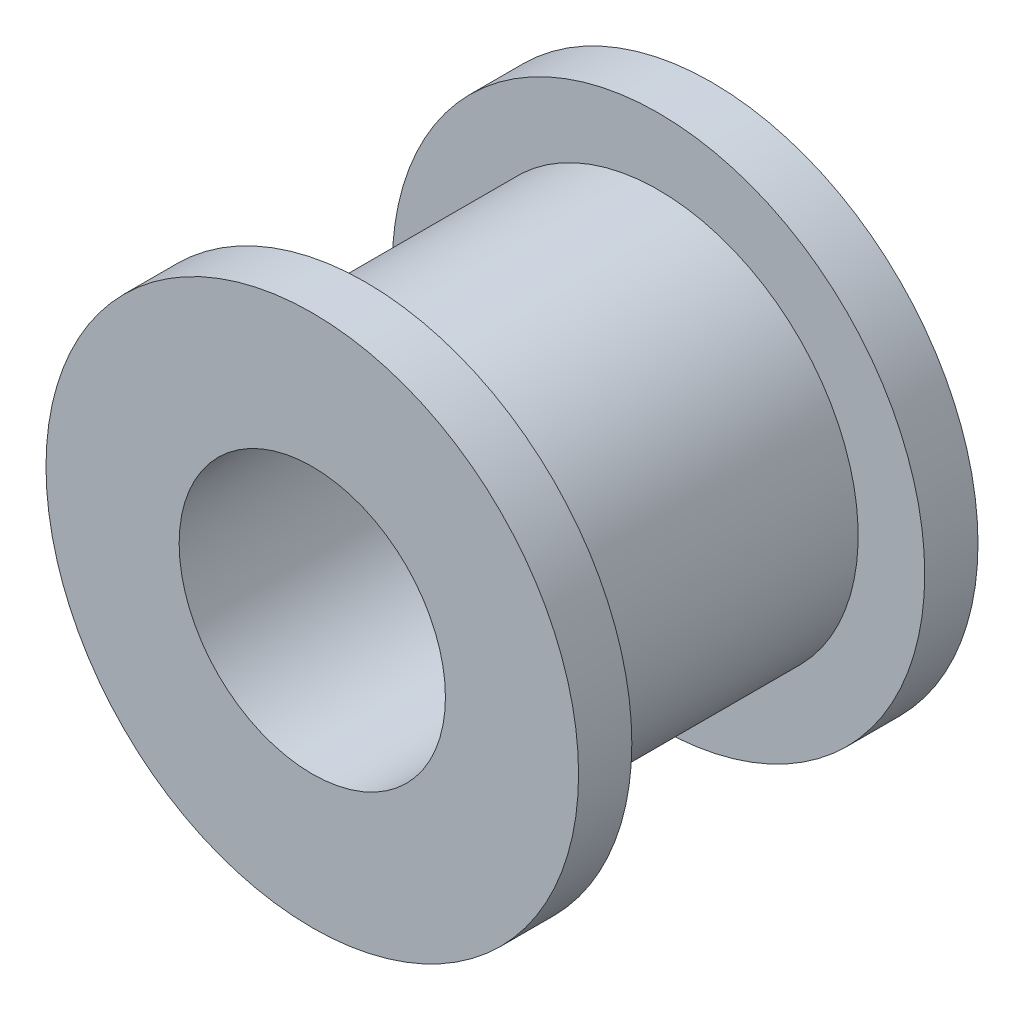
ISO-10303-21;
HEADER;
FILE_DESCRIPTION(('STEP AP214'),'2;1');
FILE_NAME('part.step','',(''),(''),'','','');
FILE_SCHEMA(('AUTOMOTIVE_DESIGN { 1 0 10303 214 1 1 1 1 }'));
ENDSEC;
DATA;
#1=APPLICATION_CONTEXT('core data for automotive mechanical design processes');
#2=APPLICATION_PROTOCOL_DEFINITION('international standard','automotive_design',2000,#1);
#3=PRODUCT_CONTEXT('',#1,'mechanical');
#4=PRODUCT('Part','Part','',(#3));
#5=PRODUCT_RELATED_PRODUCT_CATEGORY('part','',(#4));
#6=PRODUCT_DEFINITION_FORMATION('','',#4);
#7=PRODUCT_DEFINITION_CONTEXT('part definition',#1,'design');
#8=PRODUCT_DEFINITION('design','',#6,#7);
#9=PRODUCT_DEFINITION_SHAPE('','',#8);
#10=(LENGTH_UNIT() NAMED_UNIT(*) SI_UNIT(.MILLI.,.METRE.));
#11=(NAMED_UNIT(*) PLANE_ANGLE_UNIT() SI_UNIT($,.RADIAN.));
#12=(NAMED_UNIT(*) SI_UNIT($,.STERADIAN.) SOLID_ANGLE_UNIT());
#13=UNCERTAINTY_MEASURE_WITH_UNIT(LENGTH_MEASURE(1.E-05),#10,'distance_accuracy_value','');
#14=(GEOMETRIC_REPRESENTATION_CONTEXT(3) GLOBAL_UNCERTAINTY_ASSIGNED_CONTEXT((#13)) GLOBAL_UNIT_ASSIGNED_CONTEXT((#10,
#11,#12)) REPRESENTATION_CONTEXT('',''));
#15=CARTESIAN_POINT('',(0.,0.,0.));
#16=DIRECTION('',(0.,0.,1.));
#17=DIRECTION('',(1.,0.,0.));
#18=AXIS2_PLACEMENT_3D('',#15,#16,#17);
#19=CARTESIAN_POINT('',(0.,0.,11.));
#20=DIRECTION('',(0.,0.,-1.));
#21=DIRECTION('',(-1.,0.,0.));
#22=AXIS2_PLACEMENT_3D('',#19,#20,#21);
#23=CYLINDRICAL_SURFACE('',#22,7.5);
#24=CARTESIAN_POINT('',(0.,0.,11.));
#25=DIRECTION('',(0.,0.,1.));
#26=DIRECTION('',(1.,0.,0.));
#27=AXIS2_PLACEMENT_3D('',#24,#25,#26);
#28=CIRCLE('',#27,7.5);
#29=CARTESIAN_POINT('',(7.5,0.,11.));
#30=VERTEX_POINT('',#29);
#31=EDGE_CURVE('E10',#30,#30,#28,.T.);
#32=ORIENTED_EDGE('',*,*,#31,.F.);
#33=EDGE_LOOP('',(#32));
#34=FACE_BOUND('',#33,.T.);
#35=CARTESIAN_POINT('',(0.,0.,0.));
#36=DIRECTION('',(0.,0.,-1.));
#37=DIRECTION('',(-1.,0.,0.));
#38=AXIS2_PLACEMENT_3D('',#35,#36,#37);
#39=CIRCLE('',#38,7.5);
#40=CARTESIAN_POINT('',(-7.5,0.,0.));
#41=VERTEX_POINT('',#40);
#42=EDGE_CURVE('E50',#41,#41,#39,.T.);
#43=ORIENTED_EDGE('',*,*,#42,.F.);
#44=EDGE_LOOP('',(#43));
#45=FACE_BOUND('',#44,.T.);
#46=ADVANCED_FACE('F31',(#34,#45),#23,.T.);
#47=CARTESIAN_POINT('',(0.,0.,11.));
#48=DIRECTION('',(0.,0.,-1.));
#49=DIRECTION('',(-1.,0.,0.));
#50=AXIS2_PLACEMENT_3D('',#47,#48,#49);
#51=CYLINDRICAL_SURFACE('',#50,5.);
#52=CARTESIAN_POINT('',(0.,0.,13.));
#53=DIRECTION('',(0.,0.,1.));
#54=DIRECTION('',(1.,0.,0.));
#55=AXIS2_PLACEMENT_3D('',#52,#53,#54);
#56=CIRCLE('',#55,5.);
#57=CARTESIAN_POINT('',(5.,0.,13.));
#58=VERTEX_POINT('',#57);
#59=EDGE_CURVE('E46',#58,#58,#56,.T.);
#60=ORIENTED_EDGE('',*,*,#59,.T.);
#61=EDGE_LOOP('',(#60));
#62=FACE_BOUND('',#61,.T.);
#63=CARTESIAN_POINT('',(0.,0.,-2.));
#64=DIRECTION('',(0.,0.,-1.));
#65=DIRECTION('',(-1.,0.,0.));
#66=AXIS2_PLACEMENT_3D('',#63,#64,#65);
#67=CIRCLE('',#66,5.);
#68=CARTESIAN_POINT('',(-5.,0.,-2.));
#69=VERTEX_POINT('',#68);
#70=EDGE_CURVE('E57',#69,#69,#67,.T.);
#71=ORIENTED_EDGE('',*,*,#70,.T.);
#72=EDGE_LOOP('',(#71));
#73=FACE_BOUND('',#72,.T.);
#74=ADVANCED_FACE('F63',(#62,#73),#51,.F.);
#75=CARTESIAN_POINT('',(0.,0.,11.));
#76=DIRECTION('',(0.,0.,1.));
#77=DIRECTION('',(1.,0.,0.));
#78=AXIS2_PLACEMENT_3D('',#75,#76,#77);
#79=PLANE('',#78);
#80=CARTESIAN_POINT('',(0.,0.,11.));
#81=DIRECTION('',(0.,0.,1.));
#82=DIRECTION('',(1.,0.,0.));
#83=AXIS2_PLACEMENT_3D('',#80,#81,#82);
#84=CIRCLE('',#83,10.);
#85=CARTESIAN_POINT('',(10.,0.,11.));
#86=VERTEX_POINT('',#85);
#87=EDGE_CURVE('E41',#86,#86,#84,.T.);
#88=ORIENTED_EDGE('',*,*,#87,.F.);
#89=EDGE_LOOP('',(#88));
#90=FACE_BOUND('',#89,.T.);
#91=ORIENTED_EDGE('',*,*,#31,.T.);
#92=EDGE_LOOP('',(#91));
#93=FACE_BOUND('',#92,.T.);
#94=ADVANCED_FACE('F85',(#90,#93),#79,.F.);
#95=CARTESIAN_POINT('',(0.,0.,13.));
#96=DIRECTION('',(0.,0.,1.));
#97=DIRECTION('',(1.,0.,0.));
#98=AXIS2_PLACEMENT_3D('',#95,#96,#97);
#99=PLANE('',#98);
#100=CARTESIAN_POINT('',(0.,0.,13.));
#101=DIRECTION('',(0.,0.,1.));
#102=DIRECTION('',(1.,0.,0.));
#103=AXIS2_PLACEMENT_3D('',#100,#101,#102);
#104=CIRCLE('',#103,10.);
#105=CARTESIAN_POINT('',(10.,0.,13.));
#106=VERTEX_POINT('',#105);
#107=EDGE_CURVE('E37',#106,#106,#104,.T.);
#108=ORIENTED_EDGE('',*,*,#107,.T.);
#109=EDGE_LOOP('',(#108));
#110=FACE_BOUND('',#109,.T.);
#111=ORIENTED_EDGE('',*,*,#59,.F.);
#112=EDGE_LOOP('',(#111));
#113=FACE_BOUND('',#112,.T.);
#114=ADVANCED_FACE('F93',(#110,#113),#99,.T.);
#115=CARTESIAN_POINT('',(0.,0.,13.));
#116=DIRECTION('',(0.,0.,-1.));
#117=DIRECTION('',(-1.,0.,0.));
#118=AXIS2_PLACEMENT_3D('',#115,#116,#117);
#119=CYLINDRICAL_SURFACE('',#118,10.);
#120=ORIENTED_EDGE('',*,*,#107,.F.);
#121=EDGE_LOOP('',(#120));
#122=FACE_BOUND('',#121,.T.);
#123=ORIENTED_EDGE('',*,*,#87,.T.);
#124=EDGE_LOOP('',(#123));
#125=FACE_BOUND('',#124,.T.);
#126=ADVANCED_FACE('F77',(#122,#125),#119,.T.);
#127=CARTESIAN_POINT('',(0.,0.,0.));
#128=DIRECTION('',(0.,0.,-1.));
#129=DIRECTION('',(-1.,0.,0.));
#130=AXIS2_PLACEMENT_3D('',#127,#128,#129);
#131=PLANE('',#130);
#132=CARTESIAN_POINT('',(0.,0.,0.));
#133=DIRECTION('',(0.,0.,-1.));
#134=DIRECTION('',(-1.,0.,0.));
#135=AXIS2_PLACEMENT_3D('',#132,#133,#134);
#136=CIRCLE('',#135,10.);
#137=CARTESIAN_POINT('',(-10.,0.,0.));
#138=VERTEX_POINT('',#137);
#139=EDGE_CURVE('E54',#138,#138,#136,.T.);
#140=ORIENTED_EDGE('',*,*,#139,.F.);
#141=EDGE_LOOP('',(#140));
#142=FACE_BOUND('',#141,.T.);
#143=ORIENTED_EDGE('',*,*,#42,.T.);
#144=EDGE_LOOP('',(#143));
#145=FACE_BOUND('',#144,.T.);
#146=ADVANCED_FACE('F68',(#142,#145),#131,.F.);
#147=CARTESIAN_POINT('',(0.,0.,-2.));
#148=DIRECTION('',(0.,0.,-1.));
#149=DIRECTION('',(-1.,0.,0.));
#150=AXIS2_PLACEMENT_3D('',#147,#148,#149);
#151=PLANE('',#150);
#152=CARTESIAN_POINT('',(0.,0.,-2.));
#153=DIRECTION('',(0.,0.,-1.));
#154=DIRECTION('',(-1.,0.,0.));
#155=AXIS2_PLACEMENT_3D('',#152,#153,#154);
#156=CIRCLE('',#155,10.);
#157=CARTESIAN_POINT('',(-10.,0.,-2.));
#158=VERTEX_POINT('',#157);
#159=EDGE_CURVE('E53',#158,#158,#156,.T.);
#160=ORIENTED_EDGE('',*,*,#159,.T.);
#161=EDGE_LOOP('',(#160));
#162=FACE_BOUND('',#161,.T.);
#163=ORIENTED_EDGE('',*,*,#70,.F.);
#164=EDGE_LOOP('',(#163));
#165=FACE_BOUND('',#164,.T.);
#166=ADVANCED_FACE('F65',(#162,#165),#151,.T.);
#167=CARTESIAN_POINT('',(0.,0.,-2.));
#168=DIRECTION('',(0.,0.,1.));
#169=DIRECTION('',(1.,0.,0.));
#170=AXIS2_PLACEMENT_3D('',#167,#168,#169);
#171=CYLINDRICAL_SURFACE('',#170,10.);
#172=ORIENTED_EDGE('',*,*,#159,.F.);
#173=EDGE_LOOP('',(#172));
#174=FACE_BOUND('',#173,.T.);
#175=ORIENTED_EDGE('',*,*,#139,.T.);
#176=EDGE_LOOP('',(#175));
#177=FACE_BOUND('',#176,.T.);
#178=ADVANCED_FACE('F67',(#174,#177),#171,.T.);
#179=CLOSED_SHELL('',(#46,#74,#94,#114,#126,#146,#166,#178));
#180=MANIFOLD_SOLID_BREP('B2',#179);
#181=ADVANCED_BREP_SHAPE_REPRESENTATION('',(#18,#180),#14);
#182=SHAPE_DEFINITION_REPRESENTATION(#9,#181);
ENDSEC;
END-ISO-10303-21;
